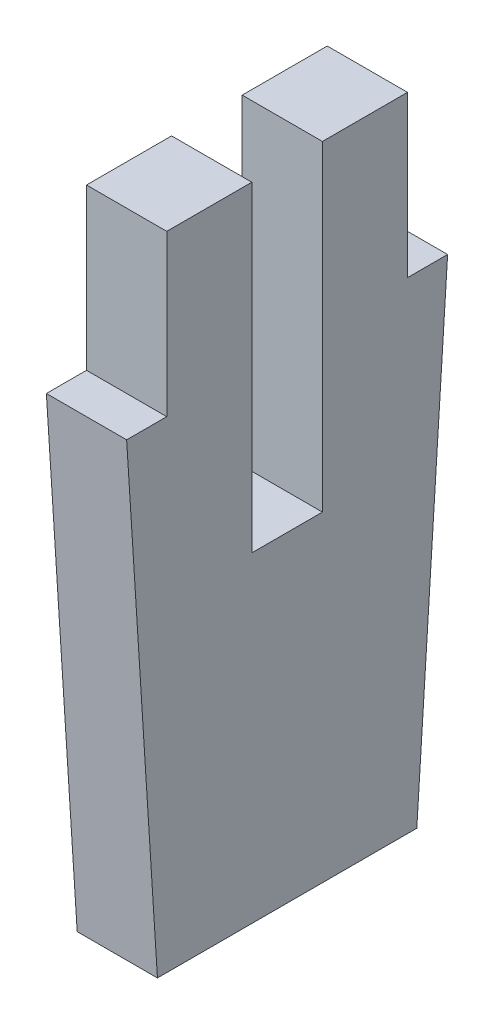
ISO-10303-21;
HEADER;
FILE_DESCRIPTION(('STEP AP214'),'2;1');
FILE_NAME('part.step','',(''),(''),'','','');
FILE_SCHEMA(('AUTOMOTIVE_DESIGN { 1 0 10303 214 1 1 1 1 }'));
ENDSEC;
DATA;
#1=APPLICATION_CONTEXT('core data for automotive mechanical design processes');
#2=APPLICATION_PROTOCOL_DEFINITION('international standard','automotive_design',2000,#1);
#3=PRODUCT_CONTEXT('',#1,'mechanical');
#4=PRODUCT('Part','Part','',(#3));
#5=PRODUCT_RELATED_PRODUCT_CATEGORY('part','',(#4));
#6=PRODUCT_DEFINITION_FORMATION('','',#4);
#7=PRODUCT_DEFINITION_CONTEXT('part definition',#1,'design');
#8=PRODUCT_DEFINITION('design','',#6,#7);
#9=PRODUCT_DEFINITION_SHAPE('','',#8);
#10=(LENGTH_UNIT() NAMED_UNIT(*) SI_UNIT(.MILLI.,.METRE.));
#11=(NAMED_UNIT(*) PLANE_ANGLE_UNIT() SI_UNIT($,.RADIAN.));
#12=(NAMED_UNIT(*) SI_UNIT($,.STERADIAN.) SOLID_ANGLE_UNIT());
#13=UNCERTAINTY_MEASURE_WITH_UNIT(LENGTH_MEASURE(1.E-05),#10,'distance_accuracy_value','');
#14=(GEOMETRIC_REPRESENTATION_CONTEXT(3) GLOBAL_UNCERTAINTY_ASSIGNED_CONTEXT((#13)) GLOBAL_UNIT_ASSIGNED_CONTEXT((#10,
#11,#12)) REPRESENTATION_CONTEXT('',''));
#15=CARTESIAN_POINT('',(0.,0.,0.));
#16=DIRECTION('',(0.,0.,1.));
#17=DIRECTION('',(1.,0.,0.));
#18=AXIS2_PLACEMENT_3D('',#15,#16,#17);
#19=CARTESIAN_POINT('',(6.35,50.8,0.));
#20=DIRECTION('',(0.,0.,-1.));
#21=DIRECTION('',(-1.,0.,0.));
#22=AXIS2_PLACEMENT_3D('',#19,#20,#21);
#23=PLANE('',#22);
#24=DIRECTION('',(0.,-1.,0.));
#25=VECTOR('',#24,1.);
#26=CARTESIAN_POINT('',(0.,50.8,0.));
#27=LINE('',#26,#25);
#28=CARTESIAN_POINT('',(0.,50.8,0.));
#29=VERTEX_POINT('',#28);
#30=CARTESIAN_POINT('',(0.,38.1,0.));
#31=VERTEX_POINT('',#30);
#32=EDGE_CURVE('E152',#29,#31,#27,.T.);
#33=ORIENTED_EDGE('',*,*,#32,.T.);
#34=DIRECTION('',(-1.,0.,0.));
#35=VECTOR('',#34,1.);
#36=CARTESIAN_POINT('',(6.35,38.1,0.));
#37=LINE('',#36,#35);
#38=CARTESIAN_POINT('',(6.35,38.1,0.));
#39=VERTEX_POINT('',#38);
#40=EDGE_CURVE('E11',#39,#31,#37,.T.);
#41=ORIENTED_EDGE('',*,*,#40,.F.);
#42=DIRECTION('',(0.,-1.,0.));
#43=VECTOR('',#42,1.);
#44=CARTESIAN_POINT('',(6.35,50.8,0.));
#45=LINE('',#44,#43);
#46=CARTESIAN_POINT('',(6.35,50.8,0.));
#47=VERTEX_POINT('',#46);
#48=EDGE_CURVE('E176',#47,#39,#45,.T.);
#49=ORIENTED_EDGE('',*,*,#48,.F.);
#50=DIRECTION('',(-1.,0.,0.));
#51=VECTOR('',#50,1.);
#52=CARTESIAN_POINT('',(6.35,50.8,0.));
#53=LINE('',#52,#51);
#54=EDGE_CURVE('E148',#47,#29,#53,.T.);
#55=ORIENTED_EDGE('',*,*,#54,.T.);
#56=EDGE_LOOP('',(#33,#41,#49,#55));
#57=FACE_BOUND('',#56,.T.);
#58=ADVANCED_FACE('F32',(#57),#23,.F.);
#59=CARTESIAN_POINT('',(6.35,38.1,0.));
#60=DIRECTION('',(0.,-1.,0.));
#61=DIRECTION('',(0.,0.,-1.));
#62=AXIS2_PLACEMENT_3D('',#59,#60,#61);
#63=PLANE('',#62);
#64=DIRECTION('',(0.,0.,1.));
#65=VECTOR('',#64,1.);
#66=CARTESIAN_POINT('',(0.,38.1,0.));
#67=LINE('',#66,#65);
#68=CARTESIAN_POINT('',(0.,38.1,3.175));
#69=VERTEX_POINT('',#68);
#70=EDGE_CURVE('E155',#31,#69,#67,.T.);
#71=ORIENTED_EDGE('',*,*,#70,.T.);
#72=DIRECTION('',(-1.,0.,0.));
#73=VECTOR('',#72,1.);
#74=CARTESIAN_POINT('',(6.35,38.1,3.175));
#75=LINE('',#74,#73);
#76=CARTESIAN_POINT('',(6.35,38.1,3.175));
#77=VERTEX_POINT('',#76);
#78=EDGE_CURVE('E40',#77,#69,#75,.T.);
#79=ORIENTED_EDGE('',*,*,#78,.F.);
#80=DIRECTION('',(0.,0.,1.));
#81=VECTOR('',#80,1.);
#82=CARTESIAN_POINT('',(6.35,38.1,0.));
#83=LINE('',#82,#81);
#84=EDGE_CURVE('E103',#39,#77,#83,.T.);
#85=ORIENTED_EDGE('',*,*,#84,.F.);
#86=ORIENTED_EDGE('',*,*,#40,.T.);
#87=EDGE_LOOP('',(#71,#79,#85,#86));
#88=FACE_BOUND('',#87,.T.);
#89=ADVANCED_FACE('F203',(#88),#63,.F.);
#90=CARTESIAN_POINT('',(6.35,6.35,1.143));
#91=DIRECTION('',(0.,0.0638693292837022,-0.997958270057847));
#92=DIRECTION('',(0.,0.997958270057847,0.0638693292837022));
#93=AXIS2_PLACEMENT_3D('',#90,#91,#92);
#94=PLANE('',#93);
#95=DIRECTION('',(0.,-0.997958270057847,-0.0638693292837022));
#96=VECTOR('',#95,1.);
#97=CARTESIAN_POINT('',(0.,6.35,1.143));
#98=LINE('',#97,#96);
#99=CARTESIAN_POINT('',(0.,0.,0.7366));
#100=VERTEX_POINT('',#99);
#101=EDGE_CURVE('E158',#69,#100,#98,.T.);
#102=ORIENTED_EDGE('',*,*,#101,.T.);
#103=DIRECTION('',(-1.,0.,0.));
#104=VECTOR('',#103,1.);
#105=CARTESIAN_POINT('',(6.35,0.,0.7366));
#106=LINE('',#105,#104);
#107=CARTESIAN_POINT('',(6.35,0.,0.7366));
#108=VERTEX_POINT('',#107);
#109=EDGE_CURVE('E195',#108,#100,#106,.T.);
#110=ORIENTED_EDGE('',*,*,#109,.F.);
#111=DIRECTION('',(0.,-0.997958270057847,-0.0638693292837022));
#112=VECTOR('',#111,1.);
#113=CARTESIAN_POINT('',(6.35,38.1,3.175));
#114=LINE('',#113,#112);
#115=EDGE_CURVE('E202',#77,#108,#114,.T.);
#116=ORIENTED_EDGE('',*,*,#115,.F.);
#117=ORIENTED_EDGE('',*,*,#78,.T.);
#118=EDGE_LOOP('',(#102,#110,#116,#117));
#119=FACE_BOUND('',#118,.T.);
#120=ADVANCED_FACE('F200',(#119),#94,.F.);
#121=CARTESIAN_POINT('',(6.35,0.,0.7366));
#122=DIRECTION('',(0.,1.,0.));
#123=DIRECTION('',(0.,0.,1.));
#124=AXIS2_PLACEMENT_3D('',#121,#122,#123);
#125=PLANE('',#124);
#126=DIRECTION('',(0.,0.,-1.));
#127=VECTOR('',#126,1.);
#128=CARTESIAN_POINT('',(0.,0.,0.7366));
#129=LINE('',#128,#127);
#130=CARTESIAN_POINT('',(0.,0.,-19.7866));
#131=VERTEX_POINT('',#130);
#132=EDGE_CURVE('E160',#100,#131,#129,.T.);
#133=ORIENTED_EDGE('',*,*,#132,.T.);
#134=DIRECTION('',(-1.,0.,0.));
#135=VECTOR('',#134,1.);
#136=CARTESIAN_POINT('',(6.35,0.,-19.7866));
#137=LINE('',#136,#135);
#138=CARTESIAN_POINT('',(6.35,0.,-19.7866));
#139=VERTEX_POINT('',#138);
#140=EDGE_CURVE('E192',#139,#131,#137,.T.);
#141=ORIENTED_EDGE('',*,*,#140,.F.);
#142=DIRECTION('',(0.,0.,-1.));
#143=VECTOR('',#142,1.);
#144=CARTESIAN_POINT('',(6.35,0.,0.7366));
#145=LINE('',#144,#143);
#146=EDGE_CURVE('E221',#108,#139,#145,.T.);
#147=ORIENTED_EDGE('',*,*,#146,.F.);
#148=ORIENTED_EDGE('',*,*,#109,.T.);
#149=EDGE_LOOP('',(#133,#141,#147,#148));
#150=FACE_BOUND('',#149,.T.);
#151=ADVANCED_FACE('F212',(#150),#125,.F.);
#152=CARTESIAN_POINT('',(6.35,38.1,-22.225));
#153=DIRECTION('',(0.,0.0638693292837023,0.997958270057847));
#154=DIRECTION('',(0.,-0.997958270057847,0.0638693292837023));
#155=AXIS2_PLACEMENT_3D('',#152,#153,#154);
#156=PLANE('',#155);
#157=DIRECTION('',(0.,0.997958270057847,-0.0638693292837023));
#158=VECTOR('',#157,1.);
#159=CARTESIAN_POINT('',(0.,38.1,-22.225));
#160=LINE('',#159,#158);
#161=CARTESIAN_POINT('',(0.,38.1,-22.225));
#162=VERTEX_POINT('',#161);
#163=EDGE_CURVE('E163',#131,#162,#160,.T.);
#164=ORIENTED_EDGE('',*,*,#163,.T.);
#165=DIRECTION('',(-1.,0.,0.));
#166=VECTOR('',#165,1.);
#167=CARTESIAN_POINT('',(6.35,38.1,-22.225));
#168=LINE('',#167,#166);
#169=CARTESIAN_POINT('',(6.35,38.1,-22.225));
#170=VERTEX_POINT('',#169);
#171=EDGE_CURVE('E189',#170,#162,#168,.T.);
#172=ORIENTED_EDGE('',*,*,#171,.F.);
#173=DIRECTION('',(0.,0.997958270057847,-0.0638693292837018));
#174=VECTOR('',#173,1.);
#175=CARTESIAN_POINT('',(6.35,6.35,-20.193));
#176=LINE('',#175,#174);
#177=EDGE_CURVE('E218',#139,#170,#176,.T.);
#178=ORIENTED_EDGE('',*,*,#177,.F.);
#179=ORIENTED_EDGE('',*,*,#140,.T.);
#180=EDGE_LOOP('',(#164,#172,#178,#179));
#181=FACE_BOUND('',#180,.T.);
#182=ADVANCED_FACE('F216',(#181),#156,.F.);
#183=CARTESIAN_POINT('',(6.35,38.1,-19.05));
#184=DIRECTION('',(0.,-1.,0.));
#185=DIRECTION('',(0.,0.,-1.));
#186=AXIS2_PLACEMENT_3D('',#183,#184,#185);
#187=PLANE('',#186);
#188=DIRECTION('',(0.,0.,1.));
#189=VECTOR('',#188,1.);
#190=CARTESIAN_POINT('',(0.,38.1,-19.05));
#191=LINE('',#190,#189);
#192=CARTESIAN_POINT('',(0.,38.1,-19.05));
#193=VERTEX_POINT('',#192);
#194=EDGE_CURVE('E165',#162,#193,#191,.T.);
#195=ORIENTED_EDGE('',*,*,#194,.T.);
#196=DIRECTION('',(-1.,0.,0.));
#197=VECTOR('',#196,1.);
#198=CARTESIAN_POINT('',(6.35,38.1,-19.05));
#199=LINE('',#198,#197);
#200=CARTESIAN_POINT('',(6.35,38.1,-19.05));
#201=VERTEX_POINT('',#200);
#202=EDGE_CURVE('E186',#201,#193,#199,.T.);
#203=ORIENTED_EDGE('',*,*,#202,.F.);
#204=DIRECTION('',(0.,0.,1.));
#205=VECTOR('',#204,1.);
#206=CARTESIAN_POINT('',(6.35,38.1,-19.05));
#207=LINE('',#206,#205);
#208=EDGE_CURVE('E220',#170,#201,#207,.T.);
#209=ORIENTED_EDGE('',*,*,#208,.F.);
#210=ORIENTED_EDGE('',*,*,#171,.T.);
#211=EDGE_LOOP('',(#195,#203,#209,#210));
#212=FACE_BOUND('',#211,.T.);
#213=ADVANCED_FACE('F245',(#212),#187,.F.);
#214=CARTESIAN_POINT('',(6.35,50.8,-19.05));
#215=DIRECTION('',(0.,0.,1.));
#216=DIRECTION('',(1.,0.,0.));
#217=AXIS2_PLACEMENT_3D('',#214,#215,#216);
#218=PLANE('',#217);
#219=DIRECTION('',(0.,1.,0.));
#220=VECTOR('',#219,1.);
#221=CARTESIAN_POINT('',(0.,50.8,-19.05));
#222=LINE('',#221,#220);
#223=CARTESIAN_POINT('',(0.,50.8,-19.05));
#224=VERTEX_POINT('',#223);
#225=EDGE_CURVE('E167',#193,#224,#222,.T.);
#226=ORIENTED_EDGE('',*,*,#225,.T.);
#227=DIRECTION('',(-1.,0.,0.));
#228=VECTOR('',#227,1.);
#229=CARTESIAN_POINT('',(6.35,50.8,-19.05));
#230=LINE('',#229,#228);
#231=CARTESIAN_POINT('',(6.35,50.8,-19.05));
#232=VERTEX_POINT('',#231);
#233=EDGE_CURVE('E183',#232,#224,#230,.T.);
#234=ORIENTED_EDGE('',*,*,#233,.F.);
#235=DIRECTION('',(0.,1.,0.));
#236=VECTOR('',#235,1.);
#237=CARTESIAN_POINT('',(6.35,50.8,-19.05));
#238=LINE('',#237,#236);
#239=EDGE_CURVE('E223',#201,#232,#238,.T.);
#240=ORIENTED_EDGE('',*,*,#239,.F.);
#241=ORIENTED_EDGE('',*,*,#202,.T.);
#242=EDGE_LOOP('',(#226,#234,#240,#241));
#243=FACE_BOUND('',#242,.T.);
#244=ADVANCED_FACE('F242',(#243),#218,.F.);
#245=CARTESIAN_POINT('',(6.35,50.8,-12.319));
#246=DIRECTION('',(0.,-1.,0.));
#247=DIRECTION('',(0.,0.,-1.));
#248=AXIS2_PLACEMENT_3D('',#245,#246,#247);
#249=PLANE('',#248);
#250=DIRECTION('',(0.,0.,1.));
#251=VECTOR('',#250,1.);
#252=CARTESIAN_POINT('',(0.,50.8,-12.319));
#253=LINE('',#252,#251);
#254=CARTESIAN_POINT('',(0.,50.8,-12.319));
#255=VERTEX_POINT('',#254);
#256=EDGE_CURVE('E169',#224,#255,#253,.T.);
#257=ORIENTED_EDGE('',*,*,#256,.T.);
#258=DIRECTION('',(-1.,0.,0.));
#259=VECTOR('',#258,1.);
#260=CARTESIAN_POINT('',(6.35,50.8,-12.319));
#261=LINE('',#260,#259);
#262=CARTESIAN_POINT('',(6.35,50.8,-12.319));
#263=VERTEX_POINT('',#262);
#264=EDGE_CURVE('E180',#263,#255,#261,.T.);
#265=ORIENTED_EDGE('',*,*,#264,.F.);
#266=DIRECTION('',(0.,0.,1.));
#267=VECTOR('',#266,1.);
#268=CARTESIAN_POINT('',(6.35,50.8,-12.319));
#269=LINE('',#268,#267);
#270=EDGE_CURVE('E229',#232,#263,#269,.T.);
#271=ORIENTED_EDGE('',*,*,#270,.F.);
#272=ORIENTED_EDGE('',*,*,#233,.T.);
#273=EDGE_LOOP('',(#257,#265,#271,#272));
#274=FACE_BOUND('',#273,.T.);
#275=ADVANCED_FACE('F235',(#274),#249,.F.);
#276=CARTESIAN_POINT('',(6.35,50.8,-12.319));
#277=DIRECTION('',(0.,0.,-1.));
#278=DIRECTION('',(0.,1.,0.));
#279=AXIS2_PLACEMENT_3D('',#276,#277,#278);
#280=PLANE('',#279);
#281=DIRECTION('',(0.,-1.,0.));
#282=VECTOR('',#281,1.);
#283=CARTESIAN_POINT('',(0.,50.8,-12.319));
#284=LINE('',#283,#282);
#285=CARTESIAN_POINT('',(0.,25.4,-12.319));
#286=VERTEX_POINT('',#285);
#287=EDGE_CURVE('E171',#255,#286,#284,.T.);
#288=ORIENTED_EDGE('',*,*,#287,.T.);
#289=DIRECTION('',(-1.,0.,0.));
#290=VECTOR('',#289,1.);
#291=CARTESIAN_POINT('',(6.35,25.4,-12.319));
#292=LINE('',#291,#290);
#293=CARTESIAN_POINT('',(6.35,25.4,-12.319));
#294=VERTEX_POINT('',#293);
#295=EDGE_CURVE('E143',#294,#286,#292,.T.);
#296=ORIENTED_EDGE('',*,*,#295,.F.);
#297=DIRECTION('',(0.,-1.,0.));
#298=VECTOR('',#297,1.);
#299=CARTESIAN_POINT('',(6.35,50.8,-12.319));
#300=LINE('',#299,#298);
#301=EDGE_CURVE('E134',#263,#294,#300,.T.);
#302=ORIENTED_EDGE('',*,*,#301,.F.);
#303=ORIENTED_EDGE('',*,*,#264,.T.);
#304=EDGE_LOOP('',(#288,#296,#302,#303));
#305=FACE_BOUND('',#304,.T.);
#306=ADVANCED_FACE('F239',(#305),#280,.F.);
#307=CARTESIAN_POINT('',(6.35,25.4,-12.319));
#308=DIRECTION('',(0.,-1.,0.));
#309=DIRECTION('',(0.,0.,-1.));
#310=AXIS2_PLACEMENT_3D('',#307,#308,#309);
#311=PLANE('',#310);
#312=DIRECTION('',(0.,0.,1.));
#313=VECTOR('',#312,1.);
#314=CARTESIAN_POINT('',(0.,25.4,-12.319));
#315=LINE('',#314,#313);
#316=CARTESIAN_POINT('',(0.,25.4,-6.73099999999999));
#317=VERTEX_POINT('',#316);
#318=EDGE_CURVE('E142',#286,#317,#315,.T.);
#319=ORIENTED_EDGE('',*,*,#318,.T.);
#320=DIRECTION('',(-1.,0.,0.));
#321=VECTOR('',#320,1.);
#322=CARTESIAN_POINT('',(6.35,25.4,-6.73099999999999));
#323=LINE('',#322,#321);
#324=CARTESIAN_POINT('',(6.35,25.4,-6.73099999999999));
#325=VERTEX_POINT('',#324);
#326=EDGE_CURVE('E139',#325,#317,#323,.T.);
#327=ORIENTED_EDGE('',*,*,#326,.F.);
#328=DIRECTION('',(0.,0.,1.));
#329=VECTOR('',#328,1.);
#330=CARTESIAN_POINT('',(6.35,25.4,-12.319));
#331=LINE('',#330,#329);
#332=EDGE_CURVE('E128',#294,#325,#331,.T.);
#333=ORIENTED_EDGE('',*,*,#332,.F.);
#334=ORIENTED_EDGE('',*,*,#295,.T.);
#335=EDGE_LOOP('',(#319,#327,#333,#334));
#336=FACE_BOUND('',#335,.T.);
#337=ADVANCED_FACE('F140',(#336),#311,.F.);
#338=CARTESIAN_POINT('',(6.35,50.8,-6.731));
#339=DIRECTION('',(0.,0.,1.));
#340=DIRECTION('',(0.,-1.,0.));
#341=AXIS2_PLACEMENT_3D('',#338,#339,#340);
#342=PLANE('',#341);
#343=DIRECTION('',(0.,1.,0.));
#344=VECTOR('',#343,1.);
#345=CARTESIAN_POINT('',(0.,50.8,-6.731));
#346=LINE('',#345,#344);
#347=CARTESIAN_POINT('',(0.,50.8,-6.731));
#348=VERTEX_POINT('',#347);
#349=EDGE_CURVE('E89',#317,#348,#346,.T.);
#350=ORIENTED_EDGE('',*,*,#349,.T.);
#351=DIRECTION('',(-1.,0.,0.));
#352=VECTOR('',#351,1.);
#353=CARTESIAN_POINT('',(6.35,50.8,-6.731));
#354=LINE('',#353,#352);
#355=CARTESIAN_POINT('',(6.35,50.8,-6.731));
#356=VERTEX_POINT('',#355);
#357=EDGE_CURVE('E144',#356,#348,#354,.T.);
#358=ORIENTED_EDGE('',*,*,#357,.F.);
#359=DIRECTION('',(0.,1.,0.));
#360=VECTOR('',#359,1.);
#361=CARTESIAN_POINT('',(6.35,50.8,-6.731));
#362=LINE('',#361,#360);
#363=EDGE_CURVE('E132',#325,#356,#362,.T.);
#364=ORIENTED_EDGE('',*,*,#363,.F.);
#365=ORIENTED_EDGE('',*,*,#326,.T.);
#366=EDGE_LOOP('',(#350,#358,#364,#365));
#367=FACE_BOUND('',#366,.T.);
#368=ADVANCED_FACE('F146',(#367),#342,.F.);
#369=CARTESIAN_POINT('',(6.35,50.8,0.));
#370=DIRECTION('',(0.,-1.,0.));
#371=DIRECTION('',(0.,0.,-1.));
#372=AXIS2_PLACEMENT_3D('',#369,#370,#371);
#373=PLANE('',#372);
#374=DIRECTION('',(0.,0.,1.));
#375=VECTOR('',#374,1.);
#376=CARTESIAN_POINT('',(0.,50.8,0.));
#377=LINE('',#376,#375);
#378=EDGE_CURVE('E95',#348,#29,#377,.T.);
#379=ORIENTED_EDGE('',*,*,#378,.T.);
#380=ORIENTED_EDGE('',*,*,#54,.F.);
#381=DIRECTION('',(0.,0.,1.));
#382=VECTOR('',#381,1.);
#383=CARTESIAN_POINT('',(6.35,50.8,0.));
#384=LINE('',#383,#382);
#385=EDGE_CURVE('E48',#356,#47,#384,.T.);
#386=ORIENTED_EDGE('',*,*,#385,.F.);
#387=ORIENTED_EDGE('',*,*,#357,.T.);
#388=EDGE_LOOP('',(#379,#380,#386,#387));
#389=FACE_BOUND('',#388,.T.);
#390=ADVANCED_FACE('F260',(#389),#373,.F.);
#391=CARTESIAN_POINT('',(6.35,0.,0.));
#392=DIRECTION('',(-1.,0.,0.));
#393=DIRECTION('',(0.,0.,1.));
#394=AXIS2_PLACEMENT_3D('',#391,#392,#393);
#395=PLANE('',#394);
#396=ORIENTED_EDGE('',*,*,#48,.T.);
#397=ORIENTED_EDGE('',*,*,#84,.T.);
#398=ORIENTED_EDGE('',*,*,#115,.T.);
#399=ORIENTED_EDGE('',*,*,#146,.T.);
#400=ORIENTED_EDGE('',*,*,#177,.T.);
#401=ORIENTED_EDGE('',*,*,#208,.T.);
#402=ORIENTED_EDGE('',*,*,#239,.T.);
#403=ORIENTED_EDGE('',*,*,#270,.T.);
#404=ORIENTED_EDGE('',*,*,#301,.T.);
#405=ORIENTED_EDGE('',*,*,#332,.T.);
#406=ORIENTED_EDGE('',*,*,#363,.T.);
#407=ORIENTED_EDGE('',*,*,#385,.T.);
#408=EDGE_LOOP('',(#396,#397,#398,#399,#400,#401,#402,#403,#404,#405,#406,#407));
#409=FACE_BOUND('',#408,.T.);
#410=ADVANCED_FACE('F130',(#409),#395,.F.);
#411=CARTESIAN_POINT('',(0.,0.,0.));
#412=DIRECTION('',(-1.,0.,0.));
#413=DIRECTION('',(0.,0.,1.));
#414=AXIS2_PLACEMENT_3D('',#411,#412,#413);
#415=PLANE('',#414);
#416=ORIENTED_EDGE('',*,*,#32,.F.);
#417=ORIENTED_EDGE('',*,*,#378,.F.);
#418=ORIENTED_EDGE('',*,*,#349,.F.);
#419=ORIENTED_EDGE('',*,*,#318,.F.);
#420=ORIENTED_EDGE('',*,*,#287,.F.);
#421=ORIENTED_EDGE('',*,*,#256,.F.);
#422=ORIENTED_EDGE('',*,*,#225,.F.);
#423=ORIENTED_EDGE('',*,*,#194,.F.);
#424=ORIENTED_EDGE('',*,*,#163,.F.);
#425=ORIENTED_EDGE('',*,*,#132,.F.);
#426=ORIENTED_EDGE('',*,*,#101,.F.);
#427=ORIENTED_EDGE('',*,*,#70,.F.);
#428=EDGE_LOOP('',(#416,#417,#418,#419,#420,#421,#422,#423,#424,#425,#426,#427));
#429=FACE_BOUND('',#428,.T.);
#430=ADVANCED_FACE('F207',(#429),#415,.T.);
#431=CLOSED_SHELL('',(#58,#89,#120,#151,#182,#213,#244,#275,#306,#337,#368,#390,#410,#430));
#432=MANIFOLD_SOLID_BREP('B2',#431);
#433=ADVANCED_BREP_SHAPE_REPRESENTATION('',(#18,#432),#14);
#434=SHAPE_DEFINITION_REPRESENTATION(#9,#433);
ENDSEC;
END-ISO-10303-21;
